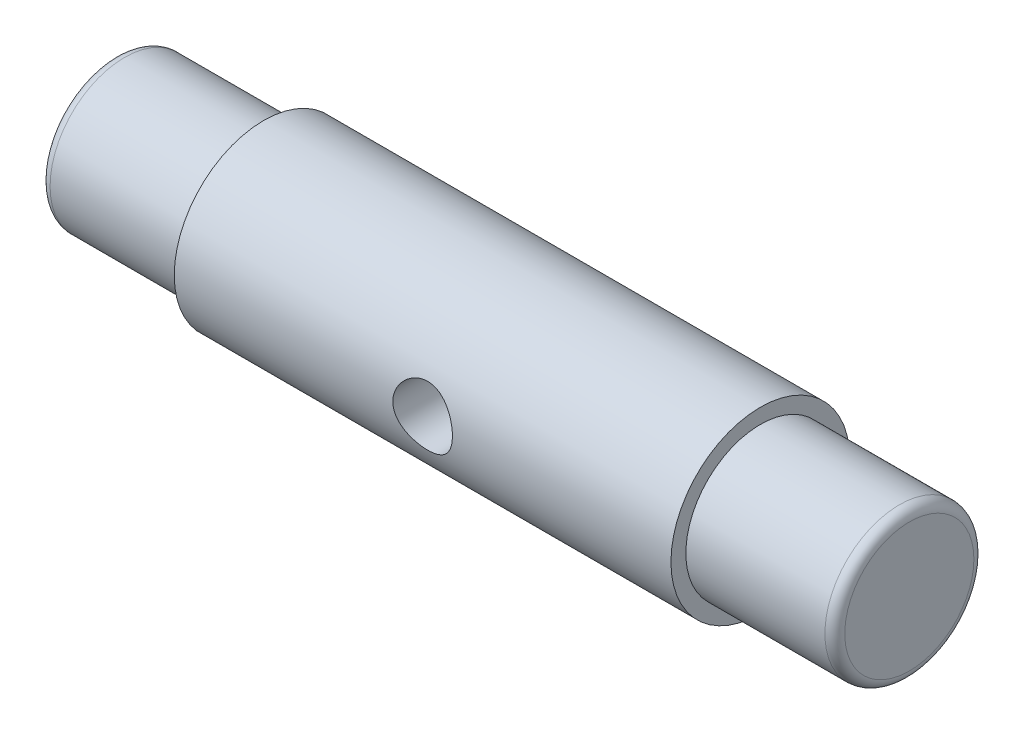
ISO-10303-21;
HEADER;
FILE_DESCRIPTION(('STEP AP214'),'2;1');
FILE_NAME('part.step','',(''),(''),'','','');
FILE_SCHEMA(('AUTOMOTIVE_DESIGN { 1 0 10303 214 1 1 1 1 }'));
ENDSEC;
DATA;
#1=APPLICATION_CONTEXT('core data for automotive mechanical design processes');
#2=APPLICATION_PROTOCOL_DEFINITION('international standard','automotive_design',2000,#1);
#3=PRODUCT_CONTEXT('',#1,'mechanical');
#4=PRODUCT('Part','Part','',(#3));
#5=PRODUCT_RELATED_PRODUCT_CATEGORY('part','',(#4));
#6=PRODUCT_DEFINITION_FORMATION('','',#4);
#7=PRODUCT_DEFINITION_CONTEXT('part definition',#1,'design');
#8=PRODUCT_DEFINITION('design','',#6,#7);
#9=PRODUCT_DEFINITION_SHAPE('','',#8);
#10=(LENGTH_UNIT() NAMED_UNIT(*) SI_UNIT(.MILLI.,.METRE.));
#11=(NAMED_UNIT(*) PLANE_ANGLE_UNIT() SI_UNIT($,.RADIAN.));
#12=(NAMED_UNIT(*) SI_UNIT($,.STERADIAN.) SOLID_ANGLE_UNIT());
#13=UNCERTAINTY_MEASURE_WITH_UNIT(LENGTH_MEASURE(1.E-05),#10,'distance_accuracy_value','');
#14=(GEOMETRIC_REPRESENTATION_CONTEXT(3) GLOBAL_UNCERTAINTY_ASSIGNED_CONTEXT((#13)) GLOBAL_UNIT_ASSIGNED_CONTEXT((#10,
#11,#12)) REPRESENTATION_CONTEXT('',''));
#15=CARTESIAN_POINT('',(0.,0.,0.));
#16=DIRECTION('',(0.,0.,1.));
#17=DIRECTION('',(1.,0.,0.));
#18=AXIS2_PLACEMENT_3D('',#15,#16,#17);
#19=CARTESIAN_POINT('',(-25.,0.,0.));
#20=DIRECTION('',(1.,0.,0.));
#21=DIRECTION('',(0.,0.,-1.));
#22=AXIS2_PLACEMENT_3D('',#19,#20,#21);
#23=CYLINDRICAL_SURFACE('',#22,9.);
#24=CARTESIAN_POINT('',(3.,0.,-8.99999999999999));
#25=CARTESIAN_POINT('',(3.00000076119492,-0.16369008866017,-9.00000045902832));
#26=CARTESIAN_POINT('',(2.98655920161835,-0.327375583615649,-8.99549308522634));
#27=CARTESIAN_POINT('',(2.93331267354834,-0.649925282618917,-8.97795630609842));
#28=CARTESIAN_POINT('',(2.89350496815323,-0.808788984356454,-8.96492601606457));
#29=CARTESIAN_POINT('',(2.78904226984786,-1.11699836850533,-8.93175923719327));
#30=CARTESIAN_POINT('',(2.72442881262218,-1.2663594776581,-8.9116346319256));
#31=CARTESIAN_POINT('',(2.57237648148496,-1.55212481041597,-8.86633337152025));
#32=CARTESIAN_POINT('',(2.4849331049922,-1.68852647087612,-8.84115572003334));
#33=CARTESIAN_POINT('',(2.28652258542375,-1.9492250250668,-8.78742283329015));
#34=CARTESIAN_POINT('',(2.17490629721853,-2.07301110089493,-8.75878669391354));
#35=CARTESIAN_POINT('',(1.9326985358803,-2.30049807810625,-8.70180944349364));
#36=CARTESIAN_POINT('',(1.80210289521446,-2.40419455646838,-8.67346839871647));
#37=CARTESIAN_POINT('',(1.52104465441062,-2.59147482668357,-8.61939997431821));
#38=CARTESIAN_POINT('',(1.37011878080363,-2.6743945746631,-8.59377117827064));
#39=CARTESIAN_POINT('',(1.05547171662436,-2.81345662163317,-8.54925916255803));
#40=CARTESIAN_POINT('',(0.89175444851177,-2.86960709216029,-8.53037388482236));
#41=CARTESIAN_POINT('',(0.561980335509872,-2.95162038452749,-8.50233909808131));
#42=CARTESIAN_POINT('',(0.396188374532811,-2.97844034481531,-8.49288287308834));
#43=CARTESIAN_POINT('',(0.0622087375323635,-3.00402337000343,-8.48386969888523));
#44=CARTESIAN_POINT('',(-0.105978182127564,-3.00279510481416,-8.4843096906819));
#45=CARTESIAN_POINT('',(-0.431809891332055,-2.97305971111026,-8.4947704502454));
#46=CARTESIAN_POINT('',(-0.589585208757047,-2.94580173950099,-8.50435247602598));
#47=CARTESIAN_POINT('',(-0.898180258820494,-2.86681848854825,-8.53129973173652));
#48=CARTESIAN_POINT('',(-1.0489991563052,-2.81509027977562,-8.54866589352323));
#49=CARTESIAN_POINT('',(-1.34223824877443,-2.68781717418064,-8.58953733393746));
#50=CARTESIAN_POINT('',(-1.48448407640857,-2.61190214612179,-8.61313697379352));
#51=CARTESIAN_POINT('',(-1.75461272483918,-2.43866731890942,-8.66377675727179));
#52=CARTESIAN_POINT('',(-1.88249138080015,-2.34134133709202,-8.69081789371391));
#53=CARTESIAN_POINT('',(-2.12727479448233,-2.12204799804672,-8.74701987503222));
#54=CARTESIAN_POINT('',(-2.24325808352721,-1.99905945022894,-8.77621768064528));
#55=CARTESIAN_POINT('',(-2.45319379999019,-1.73501870991019,-8.8322081516111));
#56=CARTESIAN_POINT('',(-2.54714411449348,-1.59396478698244,-8.85900058614202));
#57=CARTESIAN_POINT('',(-2.7110889007052,-1.2958428391388,-8.90751323813381));
#58=CARTESIAN_POINT('',(-2.78083647402219,-1.13862982924901,-8.92918050024118));
#59=CARTESIAN_POINT('',(-2.89260952186714,-0.813807250093525,-8.96461701433304));
#60=CARTESIAN_POINT('',(-2.93464462627032,-0.646201314464863,-8.97838900964638));
#61=CARTESIAN_POINT('',(-2.98816699806708,-0.313151488587915,-8.99602881214321));
#62=CARTESIAN_POINT('',(-3.00089942751825,-0.147928799594542,-9.00030005501184));
#63=CARTESIAN_POINT('',(-2.9990019792046,0.182325209880709,-8.99966708084482));
#64=CARTESIAN_POINT('',(-2.98437672006038,0.34735655795895,-8.99476441258087));
#65=CARTESIAN_POINT('',(-2.92916427679214,0.667559598912764,-8.97660074151313));
#66=CARTESIAN_POINT('',(-2.88934138185152,0.822878420504525,-8.96358596133577));
#67=CARTESIAN_POINT('',(-2.78581966659981,1.12456787573871,-8.9307554049021));
#68=CARTESIAN_POINT('',(-2.72211780159665,1.27093736552582,-8.91093876140026));
#69=CARTESIAN_POINT('',(-2.57078870447765,1.55486488917982,-8.8658679386187));
#70=CARTESIAN_POINT('',(-2.48257622015049,1.69208987765144,-8.84048444267358));
#71=CARTESIAN_POINT('',(-2.28541754995955,1.95019449040676,-8.78715761748787));
#72=CARTESIAN_POINT('',(-2.17646503190471,2.07106910338673,-8.75921350781483));
#73=CARTESIAN_POINT('',(-1.93506374698024,2.2987575234189,-8.70230543941334));
#74=CARTESIAN_POINT('',(-1.80177231921942,2.40468290773731,-8.67335283262284));
#75=CARTESIAN_POINT('',(-1.51868529656734,2.59277256697072,-8.61899919884126));
#76=CARTESIAN_POINT('',(-1.36888956409777,2.67493664379304,-8.59359820146007));
#77=CARTESIAN_POINT('',(-1.05698095413031,2.81279079124908,-8.54947175374151));
#78=CARTESIAN_POINT('',(-0.894893762493702,2.86853439649506,-8.53073282378936));
#79=CARTESIAN_POINT('',(-0.562864049867602,2.95168400027807,-8.50232496919349));
#80=CARTESIAN_POINT('',(-0.392925103786942,2.97910276486182,-8.49265195870918));
#81=CARTESIAN_POINT('',(-0.0594087118772408,3.00382884743202,-8.48393576622531));
#82=CARTESIAN_POINT('',(0.104047020860477,3.0026107719252,-8.48437200772245));
#83=CARTESIAN_POINT('',(0.42829522476619,2.97372688034608,-8.49453809471602));
#84=CARTESIAN_POINT('',(0.589087853865266,2.94606263837576,-8.50426738708085));
#85=CARTESIAN_POINT('',(0.900406989007414,2.86611543938804,-8.53153572914675));
#86=CARTESIAN_POINT('',(1.05107047501348,2.81431003804655,-8.54892294067432));
#87=CARTESIAN_POINT('',(1.3416822208148,2.68793809727924,-8.58949196455405));
#88=CARTESIAN_POINT('',(1.48162809356402,2.61336650566142,-8.6126750629018));
#89=CARTESIAN_POINT('',(1.75345100976873,2.43978207775029,-8.66348487678139));
#90=CARTESIAN_POINT('',(1.88470950569515,2.33984472829374,-8.69126134926411));
#91=CARTESIAN_POINT('',(2.12906944015261,2.11992864940695,-8.74750068849758));
#92=CARTESIAN_POINT('',(2.24216572706424,1.99994425335445,-8.77596374737116));
#93=CARTESIAN_POINT('',(2.45143323686755,1.73772467076207,-8.83170091576632));
#94=CARTESIAN_POINT('',(2.546773043253,1.59480454049919,-8.8588854540377));
#95=CARTESIAN_POINT('',(2.71197128655194,1.29407207221987,-8.90777973517836));
#96=CARTESIAN_POINT('',(2.78183623776612,1.13626355439705,-8.92949087723789));
#97=CARTESIAN_POINT('',(2.89116489746602,0.81748094160293,-8.96416545205625));
#98=CARTESIAN_POINT('',(2.93184739879013,0.656963273029228,-8.97747637267568));
#99=CARTESIAN_POINT('',(2.98626084203138,0.330961248030742,-8.99539221192665));
#100=CARTESIAN_POINT('',(2.99999923048961,0.16547827670624,-8.99999953595714));
#101=CARTESIAN_POINT('',(3.,0.,-8.99999999999999));
#102=B_SPLINE_CURVE_WITH_KNOTS('',3,(#24,#25,#26,#27,#28,#29,#30,#31,#32,#33,#34,#35,#36,#37,
#38,#39,#40,#41,#42,#43,#44,#45,#46,#47,#48,#49,#50,#51,#52,#53,#54,#55,#56,#57,#58,#59,#60,#61,
#62,#63,#64,#65,#66,#67,#68,#69,#70,#71,#72,#73,#74,#75,#76,#77,#78,#79,#80,#81,#82,#83,#84,#85,
#86,#87,#88,#89,#90,#91,#92,#93,#94,#95,#96,#97,#98,#99,#100,#101),.UNSPECIFIED.,.T.,.F.,(4,2,2,
2,2,2,2,2,2,2,2,2,2,2,2,2,2,2,2,2,2,2,2,2,2,2,2,2,2,2,2,2,2,2,2,2,2,2,4),(0.,0.490461318078033,
0.980973555802563,1.47066801861082,1.9604591333973,2.46554052848268,2.97073299862591,
3.49045154470411,4.010011340785,4.5120577722552,5.01394901962455,5.4929047965384,
5.97191792566445,6.45864513465392,6.94551307674622,7.45779917434101,7.97013437899855,
8.48755216951073,9.00479006631625,9.49960749525509,9.99434139492529,10.4747447393464,
10.9552093585231,11.4483119953121,11.9415654246567,12.4572306864226,12.9729002470499,
13.4875204148031,14.0019085411752,14.4898699819278,14.9778023805413,15.4564676124125,
15.9352391452793,16.4349020007541,16.9347063337134,17.453989825053,17.9731404345737,
18.4690967512144,18.9649159811442),.UNSPECIFIED.);
#103=CARTESIAN_POINT('',(3.,0.,-8.99999999999999));
#104=VERTEX_POINT('',#103);
#105=EDGE_CURVE('E12',#104,#104,#102,.T.);
#106=ORIENTED_EDGE('',*,*,#105,.F.);
#107=EDGE_LOOP('',(#106));
#108=FACE_BOUND('',#107,.T.);
#109=CARTESIAN_POINT('',(3.,0.,8.99999999999999));
#110=CARTESIAN_POINT('',(3.00000076119492,0.16369008866017,9.00000045902832));
#111=CARTESIAN_POINT('',(2.98655920161835,0.327375583615649,8.99549308522634));
#112=CARTESIAN_POINT('',(2.93331267354834,0.649925282618917,8.97795630609842));
#113=CARTESIAN_POINT('',(2.89350496815323,0.808788984356454,8.96492601606457));
#114=CARTESIAN_POINT('',(2.78904226984786,1.11699836850533,8.93175923719327));
#115=CARTESIAN_POINT('',(2.72442881262218,1.2663594776581,8.9116346319256));
#116=CARTESIAN_POINT('',(2.57237648148496,1.55212481041597,8.86633337152025));
#117=CARTESIAN_POINT('',(2.4849331049922,1.68852647087612,8.84115572003334));
#118=CARTESIAN_POINT('',(2.28652258542375,1.9492250250668,8.78742283329015));
#119=CARTESIAN_POINT('',(2.17490629721853,2.07301110089493,8.75878669391354));
#120=CARTESIAN_POINT('',(1.9326985358803,2.30049807810625,8.70180944349364));
#121=CARTESIAN_POINT('',(1.80210289521446,2.40419455646838,8.67346839871647));
#122=CARTESIAN_POINT('',(1.52104465441062,2.59147482668357,8.61939997431821));
#123=CARTESIAN_POINT('',(1.37011878080363,2.6743945746631,8.59377117827064));
#124=CARTESIAN_POINT('',(1.05547171662436,2.81345662163317,8.54925916255803));
#125=CARTESIAN_POINT('',(0.89175444851177,2.86960709216029,8.53037388482236));
#126=CARTESIAN_POINT('',(0.561980335509872,2.95162038452749,8.50233909808131));
#127=CARTESIAN_POINT('',(0.396188374532811,2.97844034481531,8.49288287308834));
#128=CARTESIAN_POINT('',(0.0622087375323635,3.00402337000343,8.48386969888523));
#129=CARTESIAN_POINT('',(-0.105978182127564,3.00279510481416,8.4843096906819));
#130=CARTESIAN_POINT('',(-0.431809891332055,2.97305971111026,8.4947704502454));
#131=CARTESIAN_POINT('',(-0.589585208757047,2.94580173950099,8.50435247602598));
#132=CARTESIAN_POINT('',(-0.898180258820494,2.86681848854825,8.53129973173652));
#133=CARTESIAN_POINT('',(-1.0489991563052,2.81509027977562,8.54866589352323));
#134=CARTESIAN_POINT('',(-1.34223824877443,2.68781717418064,8.58953733393746));
#135=CARTESIAN_POINT('',(-1.48448407640857,2.61190214612179,8.61313697379352));
#136=CARTESIAN_POINT('',(-1.75461272483918,2.43866731890942,8.66377675727179));
#137=CARTESIAN_POINT('',(-1.88249138080015,2.34134133709202,8.69081789371391));
#138=CARTESIAN_POINT('',(-2.12727479448233,2.12204799804672,8.74701987503222));
#139=CARTESIAN_POINT('',(-2.24325808352721,1.99905945022894,8.77621768064528));
#140=CARTESIAN_POINT('',(-2.45319379999019,1.73501870991019,8.8322081516111));
#141=CARTESIAN_POINT('',(-2.54714411449348,1.59396478698244,8.85900058614202));
#142=CARTESIAN_POINT('',(-2.7110889007052,1.2958428391388,8.90751323813381));
#143=CARTESIAN_POINT('',(-2.78083647402219,1.13862982924901,8.92918050024118));
#144=CARTESIAN_POINT('',(-2.89260952186714,0.813807250093525,8.96461701433304));
#145=CARTESIAN_POINT('',(-2.93464462627032,0.646201314464863,8.97838900964638));
#146=CARTESIAN_POINT('',(-2.98816699806708,0.313151488587915,8.99602881214321));
#147=CARTESIAN_POINT('',(-3.00089942751825,0.147928799594542,9.00030005501184));
#148=CARTESIAN_POINT('',(-2.9990019792046,-0.182325209880709,8.99966708084482));
#149=CARTESIAN_POINT('',(-2.98437672006038,-0.34735655795895,8.99476441258087));
#150=CARTESIAN_POINT('',(-2.92916427679214,-0.667559598912764,8.97660074151313));
#151=CARTESIAN_POINT('',(-2.88934138185152,-0.822878420504525,8.96358596133577));
#152=CARTESIAN_POINT('',(-2.78581966659981,-1.12456787573871,8.9307554049021));
#153=CARTESIAN_POINT('',(-2.72211780159665,-1.27093736552582,8.91093876140026));
#154=CARTESIAN_POINT('',(-2.57078870447765,-1.55486488917982,8.8658679386187));
#155=CARTESIAN_POINT('',(-2.48257622015049,-1.69208987765144,8.84048444267358));
#156=CARTESIAN_POINT('',(-2.28541754995955,-1.95019449040676,8.78715761748787));
#157=CARTESIAN_POINT('',(-2.17646503190471,-2.07106910338673,8.75921350781483));
#158=CARTESIAN_POINT('',(-1.93506374698024,-2.2987575234189,8.70230543941334));
#159=CARTESIAN_POINT('',(-1.80177231921942,-2.40468290773731,8.67335283262284));
#160=CARTESIAN_POINT('',(-1.51868529656734,-2.59277256697072,8.61899919884126));
#161=CARTESIAN_POINT('',(-1.36888956409777,-2.67493664379304,8.59359820146007));
#162=CARTESIAN_POINT('',(-1.05698095413031,-2.81279079124908,8.54947175374151));
#163=CARTESIAN_POINT('',(-0.894893762493702,-2.86853439649506,8.53073282378936));
#164=CARTESIAN_POINT('',(-0.562864049867602,-2.95168400027807,8.50232496919349));
#165=CARTESIAN_POINT('',(-0.392925103786942,-2.97910276486182,8.49265195870918));
#166=CARTESIAN_POINT('',(-0.0594087118772408,-3.00382884743202,8.48393576622531));
#167=CARTESIAN_POINT('',(0.104047020860477,-3.0026107719252,8.48437200772245));
#168=CARTESIAN_POINT('',(0.42829522476619,-2.97372688034608,8.49453809471602));
#169=CARTESIAN_POINT('',(0.589087853865266,-2.94606263837576,8.50426738708085));
#170=CARTESIAN_POINT('',(0.900406989007414,-2.86611543938804,8.53153572914675));
#171=CARTESIAN_POINT('',(1.05107047501348,-2.81431003804655,8.54892294067432));
#172=CARTESIAN_POINT('',(1.3416822208148,-2.68793809727924,8.58949196455405));
#173=CARTESIAN_POINT('',(1.48162809356402,-2.61336650566142,8.6126750629018));
#174=CARTESIAN_POINT('',(1.75345100976873,-2.43978207775029,8.66348487678139));
#175=CARTESIAN_POINT('',(1.88470950569515,-2.33984472829374,8.69126134926411));
#176=CARTESIAN_POINT('',(2.12906944015261,-2.11992864940695,8.74750068849758));
#177=CARTESIAN_POINT('',(2.24216572706424,-1.99994425335445,8.77596374737116));
#178=CARTESIAN_POINT('',(2.45143323686755,-1.73772467076207,8.83170091576632));
#179=CARTESIAN_POINT('',(2.546773043253,-1.59480454049919,8.8588854540377));
#180=CARTESIAN_POINT('',(2.71197128655194,-1.29407207221987,8.90777973517836));
#181=CARTESIAN_POINT('',(2.78183623776612,-1.13626355439705,8.92949087723789));
#182=CARTESIAN_POINT('',(2.89116489746602,-0.81748094160293,8.96416545205625));
#183=CARTESIAN_POINT('',(2.93184739879013,-0.656963273029228,8.97747637267568));
#184=CARTESIAN_POINT('',(2.98626084203138,-0.330961248030742,8.99539221192665));
#185=CARTESIAN_POINT('',(2.99999923048961,-0.16547827670624,8.99999953595714));
#186=CARTESIAN_POINT('',(3.,0.,8.99999999999999));
#187=B_SPLINE_CURVE_WITH_KNOTS('',3,(#109,#110,#111,#112,#113,#114,#115,#116,#117,#118,#119,
#120,#121,#122,#123,#124,#125,#126,#127,#128,#129,#130,#131,#132,#133,#134,#135,#136,#137,#138,
#139,#140,#141,#142,#143,#144,#145,#146,#147,#148,#149,#150,#151,#152,#153,#154,#155,#156,#157,
#158,#159,#160,#161,#162,#163,#164,#165,#166,#167,#168,#169,#170,#171,#172,#173,#174,#175,#176,
#177,#178,#179,#180,#181,#182,#183,#184,#185,#186),.UNSPECIFIED.,.T.,.F.,(4,2,2,2,2,2,2,2,2,2,2,
2,2,2,2,2,2,2,2,2,2,2,2,2,2,2,2,2,2,2,2,2,2,2,2,2,2,2,4),(0.,0.490461318078033,
0.980973555802563,1.47066801861082,1.9604591333973,2.46554052848268,2.97073299862591,
3.49045154470411,4.010011340785,4.5120577722552,5.01394901962455,5.4929047965384,
5.97191792566445,6.45864513465392,6.94551307674622,7.45779917434101,7.97013437899855,
8.48755216951073,9.00479006631625,9.49960749525509,9.99434139492529,10.4747447393464,
10.9552093585231,11.4483119953121,11.9415654246567,12.4572306864226,12.9729002470499,
13.4875204148031,14.0019085411752,14.4898699819278,14.9778023805413,15.4564676124125,
15.9352391452793,16.4349020007541,16.9347063337134,17.453989825053,17.9731404345737,
18.4690967512144,18.9649159811442),.UNSPECIFIED.);
#188=CARTESIAN_POINT('',(3.,0.,8.99999999999999));
#189=VERTEX_POINT('',#188);
#190=EDGE_CURVE('E62',#189,#189,#187,.T.);
#191=ORIENTED_EDGE('',*,*,#190,.F.);
#192=EDGE_LOOP('',(#191));
#193=FACE_BOUND('',#192,.T.);
#194=CARTESIAN_POINT('',(-25.,0.,0.));
#195=DIRECTION('',(1.,0.,0.));
#196=DIRECTION('',(0.,0.,-1.));
#197=AXIS2_PLACEMENT_3D('',#194,#195,#196);
#198=CIRCLE('',#197,9.);
#199=CARTESIAN_POINT('',(-25.,0.,-9.));
#200=VERTEX_POINT('',#199);
#201=EDGE_CURVE('E116',#200,#200,#198,.T.);
#202=ORIENTED_EDGE('',*,*,#201,.T.);
#203=EDGE_LOOP('',(#202));
#204=FACE_BOUND('',#203,.T.);
#205=CARTESIAN_POINT('',(25.,0.,0.));
#206=DIRECTION('',(1.,0.,0.));
#207=DIRECTION('',(0.,0.,-1.));
#208=AXIS2_PLACEMENT_3D('',#205,#206,#207);
#209=CIRCLE('',#208,9.);
#210=CARTESIAN_POINT('',(25.,0.,-9.));
#211=VERTEX_POINT('',#210);
#212=EDGE_CURVE('E119',#211,#211,#209,.T.);
#213=ORIENTED_EDGE('',*,*,#212,.F.);
#214=EDGE_LOOP('',(#213));
#215=FACE_BOUND('',#214,.T.);
#216=ADVANCED_FACE('F50',(#108,#193,#204,#215),#23,.T.);
#217=CARTESIAN_POINT('',(-25.,0.,0.));
#218=DIRECTION('',(1.,0.,0.));
#219=DIRECTION('',(0.,0.,-1.));
#220=AXIS2_PLACEMENT_3D('',#217,#218,#219);
#221=PLANE('',#220);
#222=CARTESIAN_POINT('',(-25.,0.,0.));
#223=DIRECTION('',(1.,0.,0.));
#224=DIRECTION('',(0.,0.,-1.));
#225=AXIS2_PLACEMENT_3D('',#222,#223,#224);
#226=CIRCLE('',#225,7.5);
#227=CARTESIAN_POINT('',(-25.,0.,-7.5));
#228=VERTEX_POINT('',#227);
#229=EDGE_CURVE('E113',#228,#228,#226,.T.);
#230=ORIENTED_EDGE('',*,*,#229,.T.);
#231=EDGE_LOOP('',(#230));
#232=FACE_BOUND('',#231,.T.);
#233=ORIENTED_EDGE('',*,*,#201,.F.);
#234=EDGE_LOOP('',(#233));
#235=FACE_BOUND('',#234,.T.);
#236=ADVANCED_FACE('F102',(#232,#235),#221,.F.);
#237=CARTESIAN_POINT('',(25.,0.,0.));
#238=DIRECTION('',(1.,0.,0.));
#239=DIRECTION('',(0.,0.,-1.));
#240=AXIS2_PLACEMENT_3D('',#237,#238,#239);
#241=PLANE('',#240);
#242=CARTESIAN_POINT('',(25.,0.,0.));
#243=DIRECTION('',(1.,0.,0.));
#244=DIRECTION('',(0.,0.,-1.));
#245=AXIS2_PLACEMENT_3D('',#242,#243,#244);
#246=CIRCLE('',#245,7.5);
#247=CARTESIAN_POINT('',(25.,0.,-7.5));
#248=VERTEX_POINT('',#247);
#249=EDGE_CURVE('E118',#248,#248,#246,.T.);
#250=ORIENTED_EDGE('',*,*,#249,.F.);
#251=EDGE_LOOP('',(#250));
#252=FACE_BOUND('',#251,.T.);
#253=ORIENTED_EDGE('',*,*,#212,.T.);
#254=EDGE_LOOP('',(#253));
#255=FACE_BOUND('',#254,.T.);
#256=ADVANCED_FACE('F99',(#252,#255),#241,.T.);
#257=CARTESIAN_POINT('',(40.,0.,0.));
#258=DIRECTION('',(-1.,0.,0.));
#259=DIRECTION('',(0.,0.,1.));
#260=AXIS2_PLACEMENT_3D('',#257,#258,#259);
#261=CYLINDRICAL_SURFACE('',#260,7.5);
#262=CARTESIAN_POINT('',(39.,0.,0.));
#263=DIRECTION('',(1.,0.,0.));
#264=DIRECTION('',(0.,0.,-1.));
#265=AXIS2_PLACEMENT_3D('',#262,#263,#264);
#266=CIRCLE('',#265,7.5);
#267=CARTESIAN_POINT('',(39.,0.,-7.5));
#268=VERTEX_POINT('',#267);
#269=EDGE_CURVE('E129',#268,#268,#266,.F.);
#270=ORIENTED_EDGE('',*,*,#269,.T.);
#271=EDGE_LOOP('',(#270));
#272=FACE_BOUND('',#271,.T.);
#273=ORIENTED_EDGE('',*,*,#249,.T.);
#274=EDGE_LOOP('',(#273));
#275=FACE_BOUND('',#274,.T.);
#276=ADVANCED_FACE('F95',(#272,#275),#261,.T.);
#277=CARTESIAN_POINT('',(40.,0.,0.));
#278=DIRECTION('',(1.,0.,0.));
#279=DIRECTION('',(0.,0.,-1.));
#280=AXIS2_PLACEMENT_3D('',#277,#278,#279);
#281=PLANE('',#280);
#282=CARTESIAN_POINT('',(40.,0.,0.));
#283=DIRECTION('',(1.,0.,0.));
#284=DIRECTION('',(0.,0.,-1.));
#285=AXIS2_PLACEMENT_3D('',#282,#283,#284);
#286=CIRCLE('',#285,6.5);
#287=CARTESIAN_POINT('',(40.,0.,-6.5));
#288=VERTEX_POINT('',#287);
#289=EDGE_CURVE('E122',#288,#288,#286,.T.);
#290=ORIENTED_EDGE('',*,*,#289,.T.);
#291=EDGE_LOOP('',(#290));
#292=FACE_BOUND('',#291,.T.);
#293=ADVANCED_FACE('F91',(#292),#281,.T.);
#294=CARTESIAN_POINT('',(-40.,0.,0.));
#295=DIRECTION('',(1.,0.,0.));
#296=DIRECTION('',(0.,0.,-1.));
#297=AXIS2_PLACEMENT_3D('',#294,#295,#296);
#298=CYLINDRICAL_SURFACE('',#297,7.5);
#299=CARTESIAN_POINT('',(-39.,0.,0.));
#300=DIRECTION('',(-1.,0.,0.));
#301=DIRECTION('',(0.,0.,1.));
#302=AXIS2_PLACEMENT_3D('',#299,#300,#301);
#303=CIRCLE('',#302,7.5);
#304=CARTESIAN_POINT('',(-39.,0.,7.5));
#305=VERTEX_POINT('',#304);
#306=EDGE_CURVE('E70',#305,#305,#303,.F.);
#307=ORIENTED_EDGE('',*,*,#306,.T.);
#308=EDGE_LOOP('',(#307));
#309=FACE_BOUND('',#308,.T.);
#310=ORIENTED_EDGE('',*,*,#229,.F.);
#311=EDGE_LOOP('',(#310));
#312=FACE_BOUND('',#311,.T.);
#313=ADVANCED_FACE('F87',(#309,#312),#298,.T.);
#314=CARTESIAN_POINT('',(-40.,0.,0.));
#315=DIRECTION('',(-1.,0.,0.));
#316=DIRECTION('',(0.,0.,-1.));
#317=AXIS2_PLACEMENT_3D('',#314,#315,#316);
#318=PLANE('',#317);
#319=CARTESIAN_POINT('',(-40.,0.,0.));
#320=DIRECTION('',(-1.,0.,0.));
#321=DIRECTION('',(0.,0.,1.));
#322=AXIS2_PLACEMENT_3D('',#319,#320,#321);
#323=CIRCLE('',#322,6.5);
#324=CARTESIAN_POINT('',(-40.,0.,6.5));
#325=VERTEX_POINT('',#324);
#326=EDGE_CURVE('E66',#325,#325,#323,.T.);
#327=ORIENTED_EDGE('',*,*,#326,.T.);
#328=EDGE_LOOP('',(#327));
#329=FACE_BOUND('',#328,.T.);
#330=ADVANCED_FACE('F82',(#329),#318,.T.);
#331=CARTESIAN_POINT('',(39.,0.,0.));
#332=DIRECTION('',(1.,0.,0.));
#333=DIRECTION('',(0.,0.,-1.));
#334=AXIS2_PLACEMENT_3D('',#331,#332,#333);
#335=TOROIDAL_SURFACE('',#334,6.5,1.);
#336=ORIENTED_EDGE('',*,*,#269,.F.);
#337=EDGE_LOOP('',(#336));
#338=FACE_BOUND('',#337,.T.);
#339=ORIENTED_EDGE('',*,*,#289,.F.);
#340=EDGE_LOOP('',(#339));
#341=FACE_BOUND('',#340,.T.);
#342=ADVANCED_FACE('F86',(#338,#341),#335,.T.);
#343=CARTESIAN_POINT('',(-39.,0.,0.));
#344=DIRECTION('',(-1.,0.,0.));
#345=DIRECTION('',(0.,0.,1.));
#346=AXIS2_PLACEMENT_3D('',#343,#344,#345);
#347=TOROIDAL_SURFACE('',#346,6.5,1.);
#348=ORIENTED_EDGE('',*,*,#326,.F.);
#349=EDGE_LOOP('',(#348));
#350=FACE_BOUND('',#349,.T.);
#351=ORIENTED_EDGE('',*,*,#306,.F.);
#352=EDGE_LOOP('',(#351));
#353=FACE_BOUND('',#352,.T.);
#354=ADVANCED_FACE('F52',(#350,#353),#347,.T.);
#355=CARTESIAN_POINT('',(0.,0.,-8.99999999999999));
#356=DIRECTION('',(0.,0.,1.));
#357=DIRECTION('',(1.,0.,0.));
#358=AXIS2_PLACEMENT_3D('',#355,#356,#357);
#359=CYLINDRICAL_SURFACE('',#358,3.);
#360=ORIENTED_EDGE('',*,*,#105,.T.);
#361=EDGE_LOOP('',(#360));
#362=FACE_BOUND('',#361,.T.);
#363=ORIENTED_EDGE('',*,*,#190,.T.);
#364=EDGE_LOOP('',(#363));
#365=FACE_BOUND('',#364,.T.);
#366=ADVANCED_FACE('F78',(#362,#365),#359,.F.);
#367=CLOSED_SHELL('',(#216,#236,#256,#276,#293,#313,#330,#342,#354,#366));
#368=MANIFOLD_SOLID_BREP('B2',#367);
#369=ADVANCED_BREP_SHAPE_REPRESENTATION('',(#18,#368),#14);
#370=SHAPE_DEFINITION_REPRESENTATION(#9,#369);
ENDSEC;
END-ISO-10303-21;
